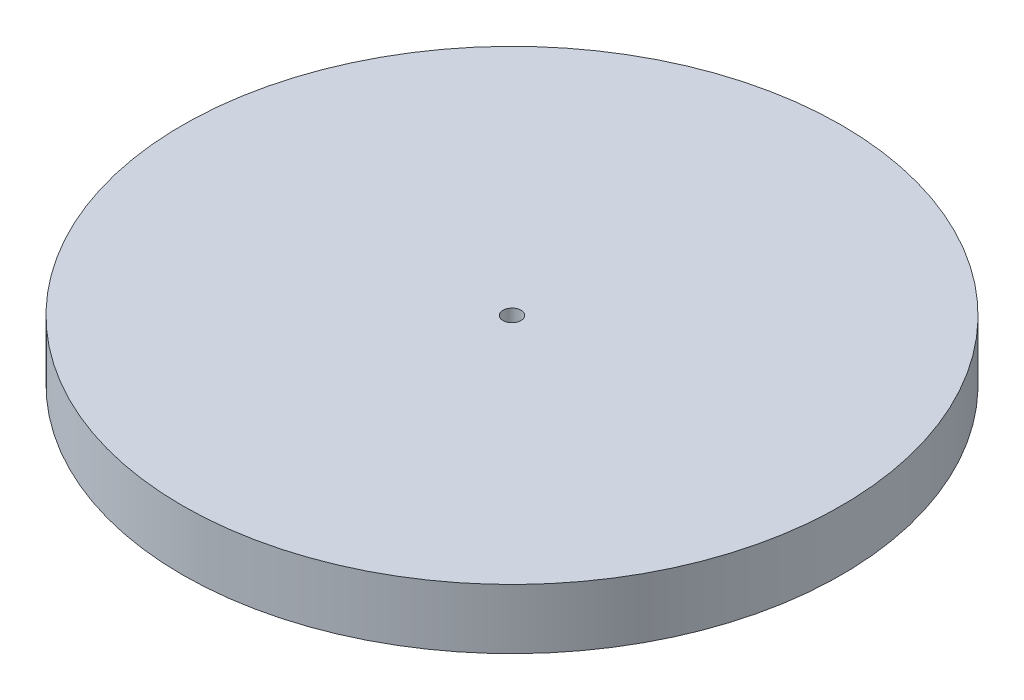
ISO-10303-21;
HEADER;
FILE_DESCRIPTION(('STEP AP214'),'2;1');
FILE_NAME('part.step','',(''),(''),'','','');
FILE_SCHEMA(('AUTOMOTIVE_DESIGN { 1 0 10303 214 1 1 1 1 }'));
ENDSEC;
DATA;
#1=APPLICATION_CONTEXT('core data for automotive mechanical design processes');
#2=APPLICATION_PROTOCOL_DEFINITION('international standard','automotive_design',2000,#1);
#3=PRODUCT_CONTEXT('',#1,'mechanical');
#4=PRODUCT('Part','Part','',(#3));
#5=PRODUCT_RELATED_PRODUCT_CATEGORY('part','',(#4));
#6=PRODUCT_DEFINITION_FORMATION('','',#4);
#7=PRODUCT_DEFINITION_CONTEXT('part definition',#1,'design');
#8=PRODUCT_DEFINITION('design','',#6,#7);
#9=PRODUCT_DEFINITION_SHAPE('','',#8);
#10=(LENGTH_UNIT() NAMED_UNIT(*) SI_UNIT(.MILLI.,.METRE.));
#11=(NAMED_UNIT(*) PLANE_ANGLE_UNIT() SI_UNIT($,.RADIAN.));
#12=(NAMED_UNIT(*) SI_UNIT($,.STERADIAN.) SOLID_ANGLE_UNIT());
#13=UNCERTAINTY_MEASURE_WITH_UNIT(LENGTH_MEASURE(1.E-05),#10,'distance_accuracy_value','');
#14=(GEOMETRIC_REPRESENTATION_CONTEXT(3) GLOBAL_UNCERTAINTY_ASSIGNED_CONTEXT((#13)) GLOBAL_UNIT_ASSIGNED_CONTEXT((#10,
#11,#12)) REPRESENTATION_CONTEXT('',''));
#15=CARTESIAN_POINT('',(0.,0.,0.));
#16=DIRECTION('',(0.,0.,1.));
#17=DIRECTION('',(1.,0.,0.));
#18=AXIS2_PLACEMENT_3D('',#15,#16,#17);
#19=CARTESIAN_POINT('',(0.,5.,0.));
#20=DIRECTION('',(0.,-1.,0.));
#21=DIRECTION('',(0.,0.,-1.));
#22=AXIS2_PLACEMENT_3D('',#19,#20,#21);
#23=CYLINDRICAL_SURFACE('',#22,12.);
#24=CARTESIAN_POINT('',(0.,5.,0.));
#25=DIRECTION('',(0.,1.,0.));
#26=DIRECTION('',(0.,0.,1.));
#27=AXIS2_PLACEMENT_3D('',#24,#25,#26);
#28=CIRCLE('',#27,12.);
#29=CARTESIAN_POINT('',(0.,5.,12.));
#30=VERTEX_POINT('',#29);
#31=EDGE_CURVE('E10',#30,#30,#28,.T.);
#32=ORIENTED_EDGE('',*,*,#31,.F.);
#33=EDGE_LOOP('',(#32));
#34=FACE_BOUND('',#33,.T.);
#35=CARTESIAN_POINT('',(0.,0.,0.));
#36=DIRECTION('',(0.,1.,0.));
#37=DIRECTION('',(0.,0.,1.));
#38=AXIS2_PLACEMENT_3D('',#35,#36,#37);
#39=CIRCLE('',#38,12.);
#40=CARTESIAN_POINT('',(0.,0.,12.));
#41=VERTEX_POINT('',#40);
#42=EDGE_CURVE('E38',#41,#41,#39,.T.);
#43=ORIENTED_EDGE('',*,*,#42,.T.);
#44=EDGE_LOOP('',(#43));
#45=FACE_BOUND('',#44,.T.);
#46=ADVANCED_FACE('F35',(#34,#45),#23,.T.);
#47=CARTESIAN_POINT('',(0.,0.,0.));
#48=DIRECTION('',(0.,1.,0.));
#49=DIRECTION('',(0.,0.,1.));
#50=AXIS2_PLACEMENT_3D('',#47,#48,#49);
#51=PLANE('',#50);
#52=CARTESIAN_POINT('',(0.,0.,0.));
#53=DIRECTION('',(0.,1.,0.));
#54=DIRECTION('',(0.,0.,1.));
#55=AXIS2_PLACEMENT_3D('',#52,#53,#54);
#56=CIRCLE('',#55,0.75);
#57=CARTESIAN_POINT('',(0.,0.,0.75));
#58=VERTEX_POINT('',#57);
#59=EDGE_CURVE('E45',#58,#58,#56,.T.);
#60=ORIENTED_EDGE('',*,*,#59,.T.);
#61=EDGE_LOOP('',(#60));
#62=FACE_BOUND('',#61,.T.);
#63=ORIENTED_EDGE('',*,*,#42,.F.);
#64=EDGE_LOOP('',(#63));
#65=FACE_BOUND('',#64,.T.);
#66=ADVANCED_FACE('F79',(#62,#65),#51,.F.);
#67=CARTESIAN_POINT('',(0.,0.,0.));
#68=DIRECTION('',(0.,1.,0.));
#69=DIRECTION('',(0.,0.,1.));
#70=AXIS2_PLACEMENT_3D('',#67,#68,#69);
#71=CYLINDRICAL_SURFACE('',#70,0.75);
#72=ORIENTED_EDGE('',*,*,#59,.F.);
#73=EDGE_LOOP('',(#72));
#74=FACE_BOUND('',#73,.T.);
#75=CARTESIAN_POINT('',(0.,10.,0.));
#76=DIRECTION('',(0.,1.,0.));
#77=DIRECTION('',(0.,0.,1.));
#78=AXIS2_PLACEMENT_3D('',#75,#76,#77);
#79=CIRCLE('',#78,0.75);
#80=CARTESIAN_POINT('',(0.,10.,0.75));
#81=VERTEX_POINT('',#80);
#82=EDGE_CURVE('E53',#81,#81,#79,.T.);
#83=ORIENTED_EDGE('',*,*,#82,.T.);
#84=EDGE_LOOP('',(#83));
#85=FACE_BOUND('',#84,.T.);
#86=ADVANCED_FACE('F59',(#74,#85),#71,.F.);
#87=CARTESIAN_POINT('',(0.,5.,0.));
#88=DIRECTION('',(0.,1.,0.));
#89=DIRECTION('',(0.,0.,1.));
#90=AXIS2_PLACEMENT_3D('',#87,#88,#89);
#91=PLANE('',#90);
#92=ORIENTED_EDGE('',*,*,#31,.T.);
#93=EDGE_LOOP('',(#92));
#94=FACE_BOUND('',#93,.T.);
#95=CARTESIAN_POINT('',(0.,5.,0.));
#96=DIRECTION('',(0.,1.,0.));
#97=DIRECTION('',(0.,0.,1.));
#98=AXIS2_PLACEMENT_3D('',#95,#96,#97);
#99=CIRCLE('',#98,27.5);
#100=CARTESIAN_POINT('',(0.,5.,27.5));
#101=VERTEX_POINT('',#100);
#102=EDGE_CURVE('E50',#101,#101,#99,.T.);
#103=ORIENTED_EDGE('',*,*,#102,.F.);
#104=EDGE_LOOP('',(#103));
#105=FACE_BOUND('',#104,.T.);
#106=ADVANCED_FACE('F65',(#94,#105),#91,.F.);
#107=CARTESIAN_POINT('',(0.,10.,0.));
#108=DIRECTION('',(0.,1.,0.));
#109=DIRECTION('',(0.,0.,1.));
#110=AXIS2_PLACEMENT_3D('',#107,#108,#109);
#111=PLANE('',#110);
#112=ORIENTED_EDGE('',*,*,#82,.F.);
#113=EDGE_LOOP('',(#112));
#114=FACE_BOUND('',#113,.T.);
#115=CARTESIAN_POINT('',(0.,10.,0.));
#116=DIRECTION('',(0.,1.,0.));
#117=DIRECTION('',(0.,0.,1.));
#118=AXIS2_PLACEMENT_3D('',#115,#116,#117);
#119=CIRCLE('',#118,27.5);
#120=CARTESIAN_POINT('',(0.,10.,27.5));
#121=VERTEX_POINT('',#120);
#122=EDGE_CURVE('E49',#121,#121,#119,.T.);
#123=ORIENTED_EDGE('',*,*,#122,.T.);
#124=EDGE_LOOP('',(#123));
#125=FACE_BOUND('',#124,.T.);
#126=ADVANCED_FACE('F61',(#114,#125),#111,.T.);
#127=CARTESIAN_POINT('',(0.,10.,0.));
#128=DIRECTION('',(0.,-1.,0.));
#129=DIRECTION('',(0.,0.,-1.));
#130=AXIS2_PLACEMENT_3D('',#127,#128,#129);
#131=CYLINDRICAL_SURFACE('',#130,27.5);
#132=ORIENTED_EDGE('',*,*,#122,.F.);
#133=EDGE_LOOP('',(#132));
#134=FACE_BOUND('',#133,.T.);
#135=ORIENTED_EDGE('',*,*,#102,.T.);
#136=EDGE_LOOP('',(#135));
#137=FACE_BOUND('',#136,.T.);
#138=ADVANCED_FACE('F64',(#134,#137),#131,.T.);
#139=CLOSED_SHELL('',(#46,#66,#86,#106,#126,#138));
#140=MANIFOLD_SOLID_BREP('B2',#139);
#141=ADVANCED_BREP_SHAPE_REPRESENTATION('',(#18,#140),#14);
#142=SHAPE_DEFINITION_REPRESENTATION(#9,#141);
ENDSEC;
END-ISO-10303-21;
